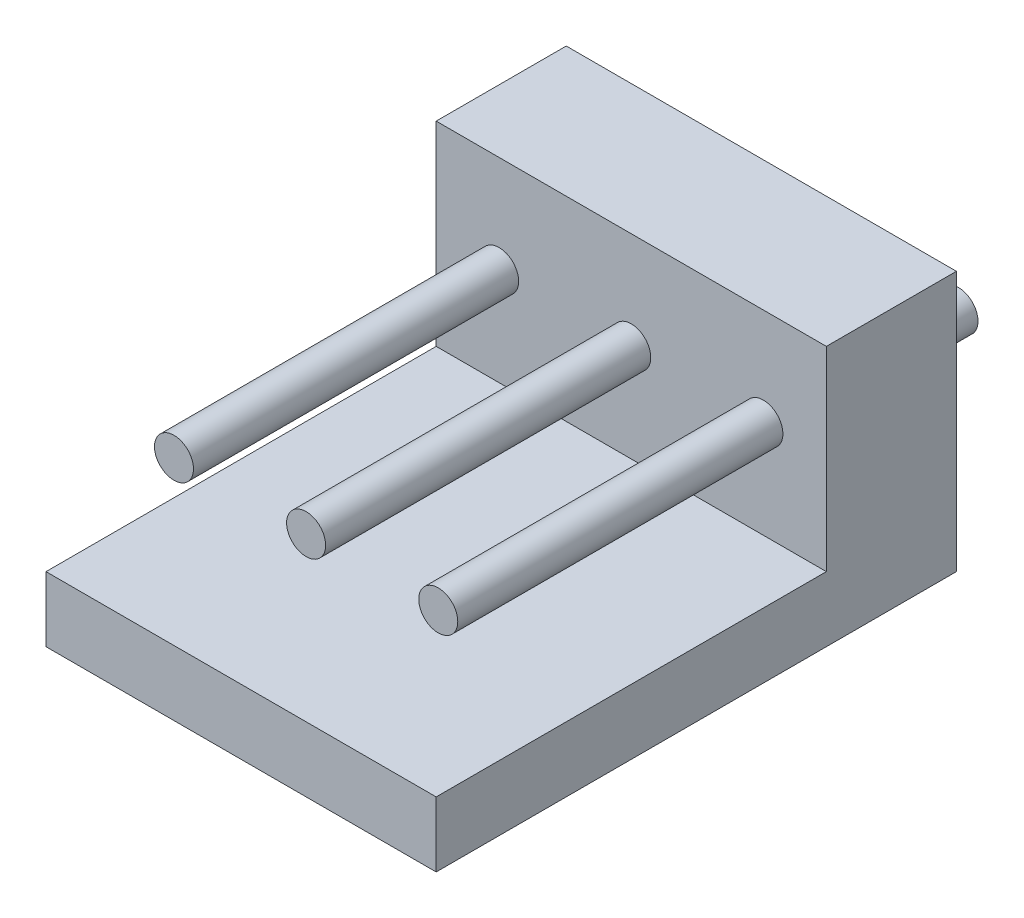
ISO-10303-21;
HEADER;
FILE_DESCRIPTION(('STEP AP214'),'2;1');
FILE_NAME('part.step','',(''),(''),'','','');
FILE_SCHEMA(('AUTOMOTIVE_DESIGN { 1 0 10303 214 1 1 1 1 }'));
ENDSEC;
DATA;
#1=APPLICATION_CONTEXT('core data for automotive mechanical design processes');
#2=APPLICATION_PROTOCOL_DEFINITION('international standard','automotive_design',2000,#1);
#3=PRODUCT_CONTEXT('',#1,'mechanical');
#4=PRODUCT('Part','Part','',(#3));
#5=PRODUCT_RELATED_PRODUCT_CATEGORY('part','',(#4));
#6=PRODUCT_DEFINITION_FORMATION('','',#4);
#7=PRODUCT_DEFINITION_CONTEXT('part definition',#1,'design');
#8=PRODUCT_DEFINITION('design','',#6,#7);
#9=PRODUCT_DEFINITION_SHAPE('','',#8);
#10=(LENGTH_UNIT() NAMED_UNIT(*) SI_UNIT(.MILLI.,.METRE.));
#11=(NAMED_UNIT(*) PLANE_ANGLE_UNIT() SI_UNIT($,.RADIAN.));
#12=(NAMED_UNIT(*) SI_UNIT($,.STERADIAN.) SOLID_ANGLE_UNIT());
#13=UNCERTAINTY_MEASURE_WITH_UNIT(LENGTH_MEASURE(1.E-05),#10,'distance_accuracy_value','');
#14=(GEOMETRIC_REPRESENTATION_CONTEXT(3) GLOBAL_UNCERTAINTY_ASSIGNED_CONTEXT((#13)) GLOBAL_UNIT_ASSIGNED_CONTEXT((#10,
#11,#12)) REPRESENTATION_CONTEXT('',''));
#15=CARTESIAN_POINT('',(0.,0.,0.));
#16=DIRECTION('',(0.,0.,1.));
#17=DIRECTION('',(1.,0.,0.));
#18=AXIS2_PLACEMENT_3D('',#15,#16,#17);
#19=CARTESIAN_POINT('',(0.,10.,5.));
#20=DIRECTION('',(0.,0.,-1.));
#21=DIRECTION('',(-1.,0.,0.));
#22=AXIS2_PLACEMENT_3D('',#19,#20,#21);
#23=PLANE('',#22);
#24=CARTESIAN_POINT('',(2.42,6.25,5.));
#25=DIRECTION('',(0.,0.,-1.));
#26=DIRECTION('',(-1.,0.,0.));
#27=AXIS2_PLACEMENT_3D('',#24,#25,#26);
#28=CIRCLE('',#27,0.750000000000001);
#29=CARTESIAN_POINT('',(1.67,6.25,5.));
#30=VERTEX_POINT('',#29);
#31=EDGE_CURVE('E38',#30,#30,#28,.F.);
#32=ORIENTED_EDGE('',*,*,#31,.F.);
#33=EDGE_LOOP('',(#32));
#34=FACE_BOUND('',#33,.T.);
#35=DIRECTION('',(-1.,0.,0.));
#36=VECTOR('',#35,1.);
#37=CARTESIAN_POINT('',(0.,2.5,5.));
#38=LINE('',#37,#36);
#39=CARTESIAN_POINT('',(15.,2.5,5.));
#40=VERTEX_POINT('',#39);
#41=CARTESIAN_POINT('',(0.,2.5,5.));
#42=VERTEX_POINT('',#41);
#43=EDGE_CURVE('E46',#40,#42,#38,.T.);
#44=ORIENTED_EDGE('',*,*,#43,.F.);
#45=DIRECTION('',(0.,1.,0.));
#46=VECTOR('',#45,1.);
#47=CARTESIAN_POINT('',(15.,0.,5.));
#48=LINE('',#47,#46);
#49=CARTESIAN_POINT('',(15.,10.,5.));
#50=VERTEX_POINT('',#49);
#51=EDGE_CURVE('E86',#40,#50,#48,.T.);
#52=ORIENTED_EDGE('',*,*,#51,.T.);
#53=DIRECTION('',(-1.,0.,0.));
#54=VECTOR('',#53,1.);
#55=CARTESIAN_POINT('',(0.,10.,5.));
#56=LINE('',#55,#54);
#57=CARTESIAN_POINT('',(0.,10.,5.));
#58=VERTEX_POINT('',#57);
#59=EDGE_CURVE('E51',#50,#58,#56,.T.);
#60=ORIENTED_EDGE('',*,*,#59,.T.);
#61=DIRECTION('',(0.,-1.,0.));
#62=VECTOR('',#61,1.);
#63=CARTESIAN_POINT('',(0.,0.,5.));
#64=LINE('',#63,#62);
#65=EDGE_CURVE('E81',#58,#42,#64,.T.);
#66=ORIENTED_EDGE('',*,*,#65,.T.);
#67=EDGE_LOOP('',(#44,#52,#60,#66));
#68=FACE_BOUND('',#67,.T.);
#69=CARTESIAN_POINT('',(12.58,6.25,5.));
#70=DIRECTION('',(0.,0.,-1.));
#71=DIRECTION('',(-1.,0.,0.));
#72=AXIS2_PLACEMENT_3D('',#69,#70,#71);
#73=CIRCLE('',#72,0.750000000000002);
#74=CARTESIAN_POINT('',(11.83,6.25,5.));
#75=VERTEX_POINT('',#74);
#76=EDGE_CURVE('E135',#75,#75,#73,.F.);
#77=ORIENTED_EDGE('',*,*,#76,.F.);
#78=EDGE_LOOP('',(#77));
#79=FACE_BOUND('',#78,.T.);
#80=CARTESIAN_POINT('',(7.5,6.25,5.));
#81=DIRECTION('',(0.,0.,-1.));
#82=DIRECTION('',(-1.,0.,0.));
#83=AXIS2_PLACEMENT_3D('',#80,#81,#82);
#84=CIRCLE('',#83,0.749999999999999);
#85=CARTESIAN_POINT('',(6.75,6.25,5.));
#86=VERTEX_POINT('',#85);
#87=EDGE_CURVE('E11',#86,#86,#84,.F.);
#88=ORIENTED_EDGE('',*,*,#87,.F.);
#89=EDGE_LOOP('',(#88));
#90=FACE_BOUND('',#89,.T.);
#91=ADVANCED_FACE('F29',(#34,#68,#79,#90),#23,.F.);
#92=CARTESIAN_POINT('',(0.,10.,0.));
#93=DIRECTION('',(0.,0.,-1.));
#94=DIRECTION('',(-1.,0.,0.));
#95=AXIS2_PLACEMENT_3D('',#92,#93,#94);
#96=PLANE('',#95);
#97=CARTESIAN_POINT('',(2.42,6.25,0.));
#98=DIRECTION('',(0.,0.,-1.));
#99=DIRECTION('',(-1.,0.,0.));
#100=AXIS2_PLACEMENT_3D('',#97,#98,#99);
#101=CIRCLE('',#100,0.750000000000001);
#102=CARTESIAN_POINT('',(1.67,6.25,0.));
#103=VERTEX_POINT('',#102);
#104=EDGE_CURVE('E118',#103,#103,#101,.F.);
#105=ORIENTED_EDGE('',*,*,#104,.T.);
#106=EDGE_LOOP('',(#105));
#107=FACE_BOUND('',#106,.T.);
#108=DIRECTION('',(0.,-1.,0.));
#109=VECTOR('',#108,1.);
#110=CARTESIAN_POINT('',(0.,0.,0.));
#111=LINE('',#110,#109);
#112=CARTESIAN_POINT('',(0.,10.,0.));
#113=VERTEX_POINT('',#112);
#114=CARTESIAN_POINT('',(0.,0.,0.));
#115=VERTEX_POINT('',#114);
#116=EDGE_CURVE('E105',#113,#115,#111,.T.);
#117=ORIENTED_EDGE('',*,*,#116,.F.);
#118=DIRECTION('',(-1.,0.,0.));
#119=VECTOR('',#118,1.);
#120=CARTESIAN_POINT('',(0.,10.,0.));
#121=LINE('',#120,#119);
#122=CARTESIAN_POINT('',(15.,10.,0.));
#123=VERTEX_POINT('',#122);
#124=EDGE_CURVE('E87',#123,#113,#121,.T.);
#125=ORIENTED_EDGE('',*,*,#124,.F.);
#126=DIRECTION('',(0.,1.,0.));
#127=VECTOR('',#126,1.);
#128=CARTESIAN_POINT('',(15.,0.,0.));
#129=LINE('',#128,#127);
#130=CARTESIAN_POINT('',(15.,0.,0.));
#131=VERTEX_POINT('',#130);
#132=EDGE_CURVE('E151',#131,#123,#129,.T.);
#133=ORIENTED_EDGE('',*,*,#132,.F.);
#134=DIRECTION('',(1.,0.,0.));
#135=VECTOR('',#134,1.);
#136=CARTESIAN_POINT('',(0.,0.,0.));
#137=LINE('',#136,#135);
#138=EDGE_CURVE('E149',#115,#131,#137,.T.);
#139=ORIENTED_EDGE('',*,*,#138,.F.);
#140=EDGE_LOOP('',(#117,#125,#133,#139));
#141=FACE_BOUND('',#140,.T.);
#142=CARTESIAN_POINT('',(12.58,6.25,0.));
#143=DIRECTION('',(0.,0.,-1.));
#144=DIRECTION('',(-1.,0.,0.));
#145=AXIS2_PLACEMENT_3D('',#142,#143,#144);
#146=CIRCLE('',#145,0.750000000000002);
#147=CARTESIAN_POINT('',(11.83,6.25,0.));
#148=VERTEX_POINT('',#147);
#149=EDGE_CURVE('E99',#148,#148,#146,.F.);
#150=ORIENTED_EDGE('',*,*,#149,.T.);
#151=EDGE_LOOP('',(#150));
#152=FACE_BOUND('',#151,.T.);
#153=CARTESIAN_POINT('',(7.5,6.25,0.));
#154=DIRECTION('',(0.,0.,-1.));
#155=DIRECTION('',(-1.,0.,0.));
#156=AXIS2_PLACEMENT_3D('',#153,#154,#155);
#157=CIRCLE('',#156,0.749999999999999);
#158=CARTESIAN_POINT('',(6.75,6.25,0.));
#159=VERTEX_POINT('',#158);
#160=EDGE_CURVE('E33',#159,#159,#157,.F.);
#161=ORIENTED_EDGE('',*,*,#160,.T.);
#162=EDGE_LOOP('',(#161));
#163=FACE_BOUND('',#162,.T.);
#164=ADVANCED_FACE('F178',(#107,#141,#152,#163),#96,.T.);
#165=CARTESIAN_POINT('',(0.,0.,5.));
#166=DIRECTION('',(1.,0.,0.));
#167=DIRECTION('',(0.,0.,-1.));
#168=AXIS2_PLACEMENT_3D('',#165,#166,#167);
#169=PLANE('',#168);
#170=ORIENTED_EDGE('',*,*,#116,.T.);
#171=DIRECTION('',(0.,0.,-1.));
#172=VECTOR('',#171,1.);
#173=CARTESIAN_POINT('',(0.,0.,5.));
#174=LINE('',#173,#172);
#175=CARTESIAN_POINT('',(0.,0.,20.));
#176=VERTEX_POINT('',#175);
#177=EDGE_CURVE('E140',#176,#115,#174,.T.);
#178=ORIENTED_EDGE('',*,*,#177,.F.);
#179=DIRECTION('',(0.,-1.,0.));
#180=VECTOR('',#179,1.);
#181=CARTESIAN_POINT('',(0.,0.,20.));
#182=LINE('',#181,#180);
#183=CARTESIAN_POINT('',(0.,2.5,20.));
#184=VERTEX_POINT('',#183);
#185=EDGE_CURVE('E98',#184,#176,#182,.T.);
#186=ORIENTED_EDGE('',*,*,#185,.F.);
#187=DIRECTION('',(0.,0.,-1.));
#188=VECTOR('',#187,1.);
#189=CARTESIAN_POINT('',(0.,2.5,20.));
#190=LINE('',#189,#188);
#191=EDGE_CURVE('E94',#184,#42,#190,.T.);
#192=ORIENTED_EDGE('',*,*,#191,.T.);
#193=ORIENTED_EDGE('',*,*,#65,.F.);
#194=DIRECTION('',(0.,0.,-1.));
#195=VECTOR('',#194,1.);
#196=CARTESIAN_POINT('',(0.,10.,5.));
#197=LINE('',#196,#195);
#198=EDGE_CURVE('E161',#58,#113,#197,.T.);
#199=ORIENTED_EDGE('',*,*,#198,.T.);
#200=EDGE_LOOP('',(#170,#178,#186,#192,#193,#199));
#201=FACE_BOUND('',#200,.T.);
#202=ADVANCED_FACE('F31',(#201),#169,.F.);
#203=CARTESIAN_POINT('',(0.,0.,5.));
#204=DIRECTION('',(0.,1.,0.));
#205=DIRECTION('',(0.,0.,1.));
#206=AXIS2_PLACEMENT_3D('',#203,#204,#205);
#207=PLANE('',#206);
#208=ORIENTED_EDGE('',*,*,#138,.T.);
#209=DIRECTION('',(0.,0.,-1.));
#210=VECTOR('',#209,1.);
#211=CARTESIAN_POINT('',(15.,0.,5.));
#212=LINE('',#211,#210);
#213=CARTESIAN_POINT('',(15.,0.,20.));
#214=VERTEX_POINT('',#213);
#215=EDGE_CURVE('E166',#214,#131,#212,.T.);
#216=ORIENTED_EDGE('',*,*,#215,.F.);
#217=DIRECTION('',(1.,0.,0.));
#218=VECTOR('',#217,1.);
#219=CARTESIAN_POINT('',(0.,0.,20.));
#220=LINE('',#219,#218);
#221=EDGE_CURVE('E144',#176,#214,#220,.T.);
#222=ORIENTED_EDGE('',*,*,#221,.F.);
#223=ORIENTED_EDGE('',*,*,#177,.T.);
#224=EDGE_LOOP('',(#208,#216,#222,#223));
#225=FACE_BOUND('',#224,.T.);
#226=ADVANCED_FACE('F174',(#225),#207,.F.);
#227=CARTESIAN_POINT('',(15.,0.,5.));
#228=DIRECTION('',(-1.,0.,0.));
#229=DIRECTION('',(0.,0.,1.));
#230=AXIS2_PLACEMENT_3D('',#227,#228,#229);
#231=PLANE('',#230);
#232=ORIENTED_EDGE('',*,*,#132,.T.);
#233=DIRECTION('',(0.,0.,-1.));
#234=VECTOR('',#233,1.);
#235=CARTESIAN_POINT('',(15.,10.,5.));
#236=LINE('',#235,#234);
#237=EDGE_CURVE('E162',#50,#123,#236,.T.);
#238=ORIENTED_EDGE('',*,*,#237,.F.);
#239=ORIENTED_EDGE('',*,*,#51,.F.);
#240=DIRECTION('',(0.,0.,-1.));
#241=VECTOR('',#240,1.);
#242=CARTESIAN_POINT('',(15.,2.5,20.));
#243=LINE('',#242,#241);
#244=CARTESIAN_POINT('',(15.,2.5,20.));
#245=VERTEX_POINT('',#244);
#246=EDGE_CURVE('E97',#245,#40,#243,.T.);
#247=ORIENTED_EDGE('',*,*,#246,.F.);
#248=DIRECTION('',(0.,1.,0.));
#249=VECTOR('',#248,1.);
#250=CARTESIAN_POINT('',(15.,0.,20.));
#251=LINE('',#250,#249);
#252=EDGE_CURVE('E107',#214,#245,#251,.T.);
#253=ORIENTED_EDGE('',*,*,#252,.F.);
#254=ORIENTED_EDGE('',*,*,#215,.T.);
#255=EDGE_LOOP('',(#232,#238,#239,#247,#253,#254));
#256=FACE_BOUND('',#255,.T.);
#257=ADVANCED_FACE('F180',(#256),#231,.F.);
#258=CARTESIAN_POINT('',(0.,10.,5.));
#259=DIRECTION('',(0.,-1.,0.));
#260=DIRECTION('',(0.,0.,-1.));
#261=AXIS2_PLACEMENT_3D('',#258,#259,#260);
#262=PLANE('',#261);
#263=ORIENTED_EDGE('',*,*,#124,.T.);
#264=ORIENTED_EDGE('',*,*,#198,.F.);
#265=ORIENTED_EDGE('',*,*,#59,.F.);
#266=ORIENTED_EDGE('',*,*,#237,.T.);
#267=EDGE_LOOP('',(#263,#264,#265,#266));
#268=FACE_BOUND('',#267,.T.);
#269=ADVANCED_FACE('F182',(#268),#262,.F.);
#270=CARTESIAN_POINT('',(0.,2.5,20.));
#271=DIRECTION('',(0.,-1.,0.));
#272=DIRECTION('',(0.,0.,-1.));
#273=AXIS2_PLACEMENT_3D('',#270,#271,#272);
#274=PLANE('',#273);
#275=ORIENTED_EDGE('',*,*,#43,.T.);
#276=ORIENTED_EDGE('',*,*,#191,.F.);
#277=DIRECTION('',(-1.,0.,0.));
#278=VECTOR('',#277,1.);
#279=CARTESIAN_POINT('',(0.,2.5,20.));
#280=LINE('',#279,#278);
#281=EDGE_CURVE('E103',#245,#184,#280,.T.);
#282=ORIENTED_EDGE('',*,*,#281,.F.);
#283=ORIENTED_EDGE('',*,*,#246,.T.);
#284=EDGE_LOOP('',(#275,#276,#282,#283));
#285=FACE_BOUND('',#284,.T.);
#286=ADVANCED_FACE('F92',(#285),#274,.F.);
#287=CARTESIAN_POINT('',(0.,2.5,20.));
#288=DIRECTION('',(0.,0.,-1.));
#289=DIRECTION('',(-1.,0.,0.));
#290=AXIS2_PLACEMENT_3D('',#287,#288,#289);
#291=PLANE('',#290);
#292=ORIENTED_EDGE('',*,*,#185,.T.);
#293=ORIENTED_EDGE('',*,*,#221,.T.);
#294=ORIENTED_EDGE('',*,*,#252,.T.);
#295=ORIENTED_EDGE('',*,*,#281,.T.);
#296=EDGE_LOOP('',(#292,#293,#294,#295));
#297=FACE_BOUND('',#296,.T.);
#298=ADVANCED_FACE('F189',(#297),#291,.F.);
#299=CARTESIAN_POINT('',(12.58,6.25,-2.5));
#300=DIRECTION('',(0.,0.,1.));
#301=DIRECTION('',(1.,0.,0.));
#302=AXIS2_PLACEMENT_3D('',#299,#300,#301);
#303=PLANE('',#302);
#304=CARTESIAN_POINT('',(12.58,6.25,-2.5));
#305=DIRECTION('',(0.,0.,1.));
#306=DIRECTION('',(1.,0.,0.));
#307=AXIS2_PLACEMENT_3D('',#304,#305,#306);
#308=CIRCLE('',#307,0.750000000000002);
#309=CARTESIAN_POINT('',(13.33,6.25,-2.5));
#310=VERTEX_POINT('',#309);
#311=EDGE_CURVE('E120',#310,#310,#308,.T.);
#312=ORIENTED_EDGE('',*,*,#311,.F.);
#313=EDGE_LOOP('',(#312));
#314=FACE_BOUND('',#313,.T.);
#315=ADVANCED_FACE('F203',(#314),#303,.F.);
#316=CARTESIAN_POINT('',(12.58,6.25,17.5));
#317=DIRECTION('',(0.,0.,-1.));
#318=DIRECTION('',(-1.,0.,0.));
#319=AXIS2_PLACEMENT_3D('',#316,#317,#318);
#320=CYLINDRICAL_SURFACE('',#319,0.750000000000002);
#321=ORIENTED_EDGE('',*,*,#149,.F.);
#322=EDGE_LOOP('',(#321));
#323=FACE_BOUND('',#322,.T.);
#324=ORIENTED_EDGE('',*,*,#311,.T.);
#325=EDGE_LOOP('',(#324));
#326=FACE_BOUND('',#325,.T.);
#327=ADVANCED_FACE('F205',(#323,#326),#320,.T.);
#328=CARTESIAN_POINT('',(12.58,6.25,17.5));
#329=DIRECTION('',(0.,0.,1.));
#330=DIRECTION('',(1.,0.,0.));
#331=AXIS2_PLACEMENT_3D('',#328,#329,#330);
#332=CIRCLE('',#331,0.750000000000002);
#333=CARTESIAN_POINT('',(13.33,6.25,17.5));
#334=VERTEX_POINT('',#333);
#335=EDGE_CURVE('E117',#334,#334,#332,.T.);
#336=ORIENTED_EDGE('',*,*,#335,.F.);
#337=EDGE_LOOP('',(#336));
#338=FACE_BOUND('',#337,.T.);
#339=ORIENTED_EDGE('',*,*,#76,.T.);
#340=EDGE_LOOP('',(#339));
#341=FACE_BOUND('',#340,.T.);
#342=ADVANCED_FACE('F208',(#338,#341),#320,.T.);
#343=CARTESIAN_POINT('',(12.58,6.25,17.5));
#344=DIRECTION('',(0.,0.,1.));
#345=DIRECTION('',(1.,0.,0.));
#346=AXIS2_PLACEMENT_3D('',#343,#344,#345);
#347=PLANE('',#346);
#348=ORIENTED_EDGE('',*,*,#335,.T.);
#349=EDGE_LOOP('',(#348));
#350=FACE_BOUND('',#349,.T.);
#351=ADVANCED_FACE('F210',(#350),#347,.T.);
#352=CARTESIAN_POINT('',(2.42,6.25,-2.5));
#353=DIRECTION('',(0.,0.,1.));
#354=DIRECTION('',(1.,0.,0.));
#355=AXIS2_PLACEMENT_3D('',#352,#353,#354);
#356=PLANE('',#355);
#357=CARTESIAN_POINT('',(2.42,6.25,-2.5));
#358=DIRECTION('',(0.,0.,1.));
#359=DIRECTION('',(1.,0.,0.));
#360=AXIS2_PLACEMENT_3D('',#357,#358,#359);
#361=CIRCLE('',#360,0.750000000000001);
#362=CARTESIAN_POINT('',(3.17,6.25,-2.5));
#363=VERTEX_POINT('',#362);
#364=EDGE_CURVE('E127',#363,#363,#361,.T.);
#365=ORIENTED_EDGE('',*,*,#364,.F.);
#366=EDGE_LOOP('',(#365));
#367=FACE_BOUND('',#366,.T.);
#368=ADVANCED_FACE('F213',(#367),#356,.F.);
#369=CARTESIAN_POINT('',(2.42,6.25,17.5));
#370=DIRECTION('',(0.,0.,-1.));
#371=DIRECTION('',(-1.,0.,0.));
#372=AXIS2_PLACEMENT_3D('',#369,#370,#371);
#373=CYLINDRICAL_SURFACE('',#372,0.750000000000001);
#374=ORIENTED_EDGE('',*,*,#104,.F.);
#375=EDGE_LOOP('',(#374));
#376=FACE_BOUND('',#375,.T.);
#377=ORIENTED_EDGE('',*,*,#364,.T.);
#378=EDGE_LOOP('',(#377));
#379=FACE_BOUND('',#378,.T.);
#380=ADVANCED_FACE('F218',(#376,#379),#373,.T.);
#381=CARTESIAN_POINT('',(2.42,6.25,17.5));
#382=DIRECTION('',(0.,0.,1.));
#383=DIRECTION('',(1.,0.,0.));
#384=AXIS2_PLACEMENT_3D('',#381,#382,#383);
#385=CIRCLE('',#384,0.750000000000001);
#386=CARTESIAN_POINT('',(3.17,6.25,17.5));
#387=VERTEX_POINT('',#386);
#388=EDGE_CURVE('E121',#387,#387,#385,.T.);
#389=ORIENTED_EDGE('',*,*,#388,.F.);
#390=EDGE_LOOP('',(#389));
#391=FACE_BOUND('',#390,.T.);
#392=ORIENTED_EDGE('',*,*,#31,.T.);
#393=EDGE_LOOP('',(#392));
#394=FACE_BOUND('',#393,.T.);
#395=ADVANCED_FACE('F221',(#391,#394),#373,.T.);
#396=CARTESIAN_POINT('',(2.42,6.25,17.5));
#397=DIRECTION('',(0.,0.,1.));
#398=DIRECTION('',(1.,0.,0.));
#399=AXIS2_PLACEMENT_3D('',#396,#397,#398);
#400=PLANE('',#399);
#401=ORIENTED_EDGE('',*,*,#388,.T.);
#402=EDGE_LOOP('',(#401));
#403=FACE_BOUND('',#402,.T.);
#404=ADVANCED_FACE('F223',(#403),#400,.T.);
#405=CARTESIAN_POINT('',(7.5,6.25,-2.5));
#406=DIRECTION('',(0.,0.,1.));
#407=DIRECTION('',(1.,0.,0.));
#408=AXIS2_PLACEMENT_3D('',#405,#406,#407);
#409=PLANE('',#408);
#410=CARTESIAN_POINT('',(7.5,6.25,-2.5));
#411=DIRECTION('',(0.,0.,1.));
#412=DIRECTION('',(1.,0.,0.));
#413=AXIS2_PLACEMENT_3D('',#410,#411,#412);
#414=CIRCLE('',#413,0.749999999999999);
#415=CARTESIAN_POINT('',(8.25,6.25,-2.5));
#416=VERTEX_POINT('',#415);
#417=EDGE_CURVE('E245',#416,#416,#414,.T.);
#418=ORIENTED_EDGE('',*,*,#417,.F.);
#419=EDGE_LOOP('',(#418));
#420=FACE_BOUND('',#419,.T.);
#421=ADVANCED_FACE('F226',(#420),#409,.F.);
#422=CARTESIAN_POINT('',(7.5,6.25,17.5));
#423=DIRECTION('',(0.,0.,-1.));
#424=DIRECTION('',(-1.,0.,0.));
#425=AXIS2_PLACEMENT_3D('',#422,#423,#424);
#426=CYLINDRICAL_SURFACE('',#425,0.749999999999999);
#427=ORIENTED_EDGE('',*,*,#160,.F.);
#428=EDGE_LOOP('',(#427));
#429=FACE_BOUND('',#428,.T.);
#430=ORIENTED_EDGE('',*,*,#417,.T.);
#431=EDGE_LOOP('',(#430));
#432=FACE_BOUND('',#431,.T.);
#433=ADVANCED_FACE('F230',(#429,#432),#426,.T.);
#434=CARTESIAN_POINT('',(7.5,6.25,17.5));
#435=DIRECTION('',(0.,0.,1.));
#436=DIRECTION('',(1.,0.,0.));
#437=AXIS2_PLACEMENT_3D('',#434,#435,#436);
#438=CIRCLE('',#437,0.749999999999999);
#439=CARTESIAN_POINT('',(8.25,6.25,17.5));
#440=VERTEX_POINT('',#439);
#441=EDGE_CURVE('E247',#440,#440,#438,.T.);
#442=ORIENTED_EDGE('',*,*,#441,.F.);
#443=EDGE_LOOP('',(#442));
#444=FACE_BOUND('',#443,.T.);
#445=ORIENTED_EDGE('',*,*,#87,.T.);
#446=EDGE_LOOP('',(#445));
#447=FACE_BOUND('',#446,.T.);
#448=ADVANCED_FACE('F233',(#444,#447),#426,.T.);
#449=CARTESIAN_POINT('',(7.5,6.25,17.5));
#450=DIRECTION('',(0.,0.,1.));
#451=DIRECTION('',(1.,0.,0.));
#452=AXIS2_PLACEMENT_3D('',#449,#450,#451);
#453=PLANE('',#452);
#454=ORIENTED_EDGE('',*,*,#441,.T.);
#455=EDGE_LOOP('',(#454));
#456=FACE_BOUND('',#455,.T.);
#457=ADVANCED_FACE('F235',(#456),#453,.T.);
#458=CLOSED_SHELL('',(#91,#164,#202,#226,#257,#269,#286,#298,#315,#327,#342,#351,#368,#380,#395,
#404,#421,#433,#448,#457));
#459=MANIFOLD_SOLID_BREP('B2',#458);
#460=ADVANCED_BREP_SHAPE_REPRESENTATION('',(#18,#459),#14);
#461=SHAPE_DEFINITION_REPRESENTATION(#9,#460);
ENDSEC;
END-ISO-10303-21;
